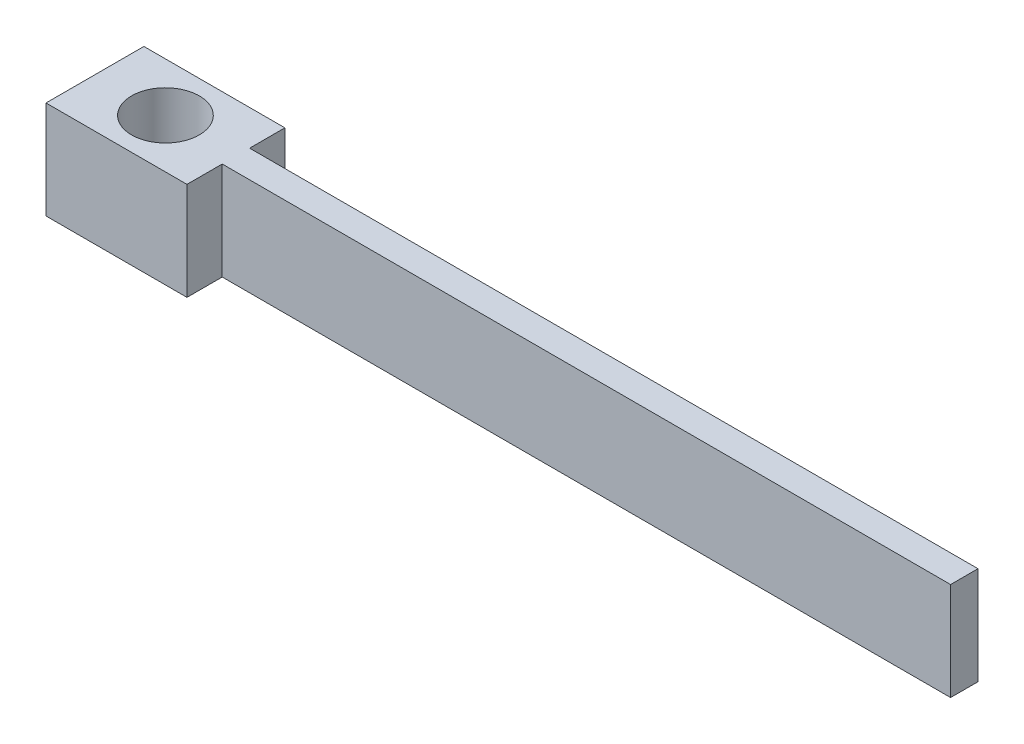
ISO-10303-21;
HEADER;
FILE_DESCRIPTION(('STEP AP214'),'2;1');
FILE_NAME('part.step','',(''),(''),'','','');
FILE_SCHEMA(('AUTOMOTIVE_DESIGN { 1 0 10303 214 1 1 1 1 }'));
ENDSEC;
DATA;
#1=APPLICATION_CONTEXT('core data for automotive mechanical design processes');
#2=APPLICATION_PROTOCOL_DEFINITION('international standard','automotive_design',2000,#1);
#3=PRODUCT_CONTEXT('',#1,'mechanical');
#4=PRODUCT('Part','Part','',(#3));
#5=PRODUCT_RELATED_PRODUCT_CATEGORY('part','',(#4));
#6=PRODUCT_DEFINITION_FORMATION('','',#4);
#7=PRODUCT_DEFINITION_CONTEXT('part definition',#1,'design');
#8=PRODUCT_DEFINITION('design','',#6,#7);
#9=PRODUCT_DEFINITION_SHAPE('','',#8);
#10=(LENGTH_UNIT() NAMED_UNIT(*) SI_UNIT(.MILLI.,.METRE.));
#11=(NAMED_UNIT(*) PLANE_ANGLE_UNIT() SI_UNIT($,.RADIAN.));
#12=(NAMED_UNIT(*) SI_UNIT($,.STERADIAN.) SOLID_ANGLE_UNIT());
#13=UNCERTAINTY_MEASURE_WITH_UNIT(LENGTH_MEASURE(1.E-05),#10,'distance_accuracy_value','');
#14=(GEOMETRIC_REPRESENTATION_CONTEXT(3) GLOBAL_UNCERTAINTY_ASSIGNED_CONTEXT((#13)) GLOBAL_UNIT_ASSIGNED_CONTEXT((#10,
#11,#12)) REPRESENTATION_CONTEXT('',''));
#15=CARTESIAN_POINT('',(0.,0.,0.));
#16=DIRECTION('',(0.,0.,1.));
#17=DIRECTION('',(1.,0.,0.));
#18=AXIS2_PLACEMENT_3D('',#15,#16,#17);
#19=CARTESIAN_POINT('',(28.194,3.175,-3.175));
#20=DIRECTION('',(-1.,0.,0.));
#21=DIRECTION('',(0.,0.,1.));
#22=AXIS2_PLACEMENT_3D('',#19,#20,#21);
#23=PLANE('',#22);
#24=DIRECTION('',(0.,1.,0.));
#25=VECTOR('',#24,1.);
#26=CARTESIAN_POINT('',(28.194,-3.175,0.889000000000001));
#27=LINE('',#26,#25);
#28=CARTESIAN_POINT('',(28.194,-3.175,0.889000000000001));
#29=VERTEX_POINT('',#28);
#30=CARTESIAN_POINT('',(28.194,3.175,0.889000000000001));
#31=VERTEX_POINT('',#30);
#32=EDGE_CURVE('E101',#29,#31,#27,.T.);
#33=ORIENTED_EDGE('',*,*,#32,.F.);
#34=DIRECTION('',(0.,0.,-1.));
#35=VECTOR('',#34,1.);
#36=CARTESIAN_POINT('',(28.194,-3.175,-3.175));
#37=LINE('',#36,#35);
#38=CARTESIAN_POINT('',(28.194,-3.175,-0.889000000000001));
#39=VERTEX_POINT('',#38);
#40=EDGE_CURVE('E112',#29,#39,#37,.T.);
#41=ORIENTED_EDGE('',*,*,#40,.T.);
#42=DIRECTION('',(0.,1.,0.));
#43=VECTOR('',#42,1.);
#44=CARTESIAN_POINT('',(28.194,-3.175,-0.889000000000001));
#45=LINE('',#44,#43);
#46=CARTESIAN_POINT('',(28.194,3.175,-0.889000000000001));
#47=VERTEX_POINT('',#46);
#48=EDGE_CURVE('E148',#39,#47,#45,.T.);
#49=ORIENTED_EDGE('',*,*,#48,.T.);
#50=DIRECTION('',(0.,0.,-1.));
#51=VECTOR('',#50,1.);
#52=CARTESIAN_POINT('',(28.194,3.175,-3.175));
#53=LINE('',#52,#51);
#54=EDGE_CURVE('E113',#31,#47,#53,.T.);
#55=ORIENTED_EDGE('',*,*,#54,.F.);
#56=EDGE_LOOP('',(#33,#41,#49,#55));
#57=FACE_BOUND('',#56,.T.);
#58=ADVANCED_FACE('F35',(#57),#23,.F.);
#59=CARTESIAN_POINT('',(-28.194,3.175,3.175));
#60=DIRECTION('',(0.,0.,-1.));
#61=DIRECTION('',(-1.,0.,0.));
#62=AXIS2_PLACEMENT_3D('',#59,#60,#61);
#63=PLANE('',#62);
#64=DIRECTION('',(0.,1.,0.));
#65=VECTOR('',#64,1.);
#66=CARTESIAN_POINT('',(-19.05,-3.175,3.17499999999999));
#67=LINE('',#66,#65);
#68=CARTESIAN_POINT('',(-19.05,-3.175,3.17499999999999));
#69=VERTEX_POINT('',#68);
#70=CARTESIAN_POINT('',(-19.05,3.175,3.17499999999999));
#71=VERTEX_POINT('',#70);
#72=EDGE_CURVE('E161',#69,#71,#67,.T.);
#73=ORIENTED_EDGE('',*,*,#72,.T.);
#74=DIRECTION('',(1.,0.,0.));
#75=VECTOR('',#74,1.);
#76=CARTESIAN_POINT('',(-28.194,3.175,3.175));
#77=LINE('',#76,#75);
#78=CARTESIAN_POINT('',(-28.194,3.175,3.175));
#79=VERTEX_POINT('',#78);
#80=EDGE_CURVE('E126',#79,#71,#77,.T.);
#81=ORIENTED_EDGE('',*,*,#80,.F.);
#82=DIRECTION('',(0.,-1.,0.));
#83=VECTOR('',#82,1.);
#84=CARTESIAN_POINT('',(-28.194,3.175,3.175));
#85=LINE('',#84,#83);
#86=CARTESIAN_POINT('',(-28.194,-3.175,3.175));
#87=VERTEX_POINT('',#86);
#88=EDGE_CURVE('E42',#79,#87,#85,.T.);
#89=ORIENTED_EDGE('',*,*,#88,.T.);
#90=DIRECTION('',(1.,0.,0.));
#91=VECTOR('',#90,1.);
#92=CARTESIAN_POINT('',(-28.194,-3.175,3.175));
#93=LINE('',#92,#91);
#94=EDGE_CURVE('E130',#87,#69,#93,.T.);
#95=ORIENTED_EDGE('',*,*,#94,.T.);
#96=EDGE_LOOP('',(#73,#81,#89,#95));
#97=FACE_BOUND('',#96,.T.);
#98=ADVANCED_FACE('F173',(#97),#63,.F.);
#99=CARTESIAN_POINT('',(0.,3.175,0.));
#100=DIRECTION('',(0.,1.,0.));
#101=DIRECTION('',(0.,0.,1.));
#102=AXIS2_PLACEMENT_3D('',#99,#100,#101);
#103=PLANE('',#102);
#104=CARTESIAN_POINT('',(-23.622,3.175,0.));
#105=DIRECTION('',(0.,1.,0.));
#106=DIRECTION('',(0.,0.,1.));
#107=AXIS2_PLACEMENT_3D('',#104,#105,#106);
#108=CIRCLE('',#107,2.1971);
#109=CARTESIAN_POINT('',(-23.622,3.175,2.1971));
#110=VERTEX_POINT('',#109);
#111=EDGE_CURVE('E123',#110,#110,#108,.T.);
#112=ORIENTED_EDGE('',*,*,#111,.F.);
#113=EDGE_LOOP('',(#112));
#114=FACE_BOUND('',#113,.T.);
#115=ORIENTED_EDGE('',*,*,#80,.T.);
#116=DIRECTION('',(0.,0.,-1.));
#117=VECTOR('',#116,1.);
#118=CARTESIAN_POINT('',(-19.05,3.175,3.17499999999999));
#119=LINE('',#118,#117);
#120=CARTESIAN_POINT('',(-19.05,3.175,0.888999999999995));
#121=VERTEX_POINT('',#120);
#122=EDGE_CURVE('E107',#71,#121,#119,.T.);
#123=ORIENTED_EDGE('',*,*,#122,.T.);
#124=DIRECTION('',(1.,0.,0.));
#125=VECTOR('',#124,1.);
#126=CARTESIAN_POINT('',(28.194,3.175,0.889000000000001));
#127=LINE('',#126,#125);
#128=EDGE_CURVE('E168',#121,#31,#127,.T.);
#129=ORIENTED_EDGE('',*,*,#128,.T.);
#130=ORIENTED_EDGE('',*,*,#54,.T.);
#131=DIRECTION('',(1.,0.,0.));
#132=VECTOR('',#131,1.);
#133=CARTESIAN_POINT('',(28.194,3.175,-0.889000000000001));
#134=LINE('',#133,#132);
#135=CARTESIAN_POINT('',(-19.05,3.175,-0.888999999999995));
#136=VERTEX_POINT('',#135);
#137=EDGE_CURVE('E154',#136,#47,#134,.T.);
#138=ORIENTED_EDGE('',*,*,#137,.F.);
#139=DIRECTION('',(0.,0.,1.));
#140=VECTOR('',#139,1.);
#141=CARTESIAN_POINT('',(-19.05,3.175,-3.17499999999999));
#142=LINE('',#141,#140);
#143=CARTESIAN_POINT('',(-19.05,3.175,-3.17499999999999));
#144=VERTEX_POINT('',#143);
#145=EDGE_CURVE('E158',#144,#136,#142,.T.);
#146=ORIENTED_EDGE('',*,*,#145,.F.);
#147=DIRECTION('',(-1.,0.,0.));
#148=VECTOR('',#147,1.);
#149=CARTESIAN_POINT('',(-28.194,3.175,-3.175));
#150=LINE('',#149,#148);
#151=CARTESIAN_POINT('',(-28.194,3.175,-3.175));
#152=VERTEX_POINT('',#151);
#153=EDGE_CURVE('E141',#144,#152,#150,.T.);
#154=ORIENTED_EDGE('',*,*,#153,.T.);
#155=DIRECTION('',(0.,0.,1.));
#156=VECTOR('',#155,1.);
#157=CARTESIAN_POINT('',(-28.194,3.175,-3.175));
#158=LINE('',#157,#156);
#159=EDGE_CURVE('E138',#152,#79,#158,.T.);
#160=ORIENTED_EDGE('',*,*,#159,.T.);
#161=EDGE_LOOP('',(#115,#123,#129,#130,#138,#146,#154,#160));
#162=FACE_BOUND('',#161,.T.);
#163=ADVANCED_FACE('F175',(#114,#162),#103,.T.);
#164=CARTESIAN_POINT('',(0.,-3.175,0.));
#165=DIRECTION('',(0.,1.,0.));
#166=DIRECTION('',(0.,0.,1.));
#167=AXIS2_PLACEMENT_3D('',#164,#165,#166);
#168=PLANE('',#167);
#169=CARTESIAN_POINT('',(-23.622,-3.175,0.));
#170=DIRECTION('',(0.,1.,0.));
#171=DIRECTION('',(0.,0.,1.));
#172=AXIS2_PLACEMENT_3D('',#169,#170,#171);
#173=CIRCLE('',#172,2.1971);
#174=CARTESIAN_POINT('',(-23.622,-3.175,2.1971));
#175=VERTEX_POINT('',#174);
#176=EDGE_CURVE('E118',#175,#175,#173,.T.);
#177=ORIENTED_EDGE('',*,*,#176,.T.);
#178=EDGE_LOOP('',(#177));
#179=FACE_BOUND('',#178,.T.);
#180=DIRECTION('',(0.,0.,-1.));
#181=VECTOR('',#180,1.);
#182=CARTESIAN_POINT('',(-19.05,-3.175,3.17499999999999));
#183=LINE('',#182,#181);
#184=CARTESIAN_POINT('',(-19.05,-3.175,0.888999999999995));
#185=VERTEX_POINT('',#184);
#186=EDGE_CURVE('E106',#69,#185,#183,.T.);
#187=ORIENTED_EDGE('',*,*,#186,.F.);
#188=ORIENTED_EDGE('',*,*,#94,.F.);
#189=DIRECTION('',(0.,0.,1.));
#190=VECTOR('',#189,1.);
#191=CARTESIAN_POINT('',(-28.194,-3.175,-3.175));
#192=LINE('',#191,#190);
#193=CARTESIAN_POINT('',(-28.194,-3.175,-3.175));
#194=VERTEX_POINT('',#193);
#195=EDGE_CURVE('E120',#194,#87,#192,.T.);
#196=ORIENTED_EDGE('',*,*,#195,.F.);
#197=DIRECTION('',(-1.,0.,0.));
#198=VECTOR('',#197,1.);
#199=CARTESIAN_POINT('',(-28.194,-3.175,-3.175));
#200=LINE('',#199,#198);
#201=CARTESIAN_POINT('',(-19.05,-3.175,-3.17499999999999));
#202=VERTEX_POINT('',#201);
#203=EDGE_CURVE('E117',#202,#194,#200,.T.);
#204=ORIENTED_EDGE('',*,*,#203,.F.);
#205=DIRECTION('',(0.,0.,1.));
#206=VECTOR('',#205,1.);
#207=CARTESIAN_POINT('',(-19.05,-3.175,-3.17499999999999));
#208=LINE('',#207,#206);
#209=CARTESIAN_POINT('',(-19.05,-3.175,-0.888999999999995));
#210=VERTEX_POINT('',#209);
#211=EDGE_CURVE('E157',#202,#210,#208,.T.);
#212=ORIENTED_EDGE('',*,*,#211,.T.);
#213=DIRECTION('',(1.,0.,0.));
#214=VECTOR('',#213,1.);
#215=CARTESIAN_POINT('',(28.194,-3.175,-0.889000000000001));
#216=LINE('',#215,#214);
#217=EDGE_CURVE('E57',#210,#39,#216,.T.);
#218=ORIENTED_EDGE('',*,*,#217,.T.);
#219=ORIENTED_EDGE('',*,*,#40,.F.);
#220=DIRECTION('',(1.,0.,0.));
#221=VECTOR('',#220,1.);
#222=CARTESIAN_POINT('',(28.194,-3.175,0.889000000000001));
#223=LINE('',#222,#221);
#224=EDGE_CURVE('E98',#185,#29,#223,.T.);
#225=ORIENTED_EDGE('',*,*,#224,.F.);
#226=EDGE_LOOP('',(#187,#188,#196,#204,#212,#218,#219,#225));
#227=FACE_BOUND('',#226,.T.);
#228=ADVANCED_FACE('F115',(#179,#227),#168,.F.);
#229=CARTESIAN_POINT('',(-28.194,3.175,-3.175));
#230=DIRECTION('',(0.,0.,1.));
#231=DIRECTION('',(1.,0.,0.));
#232=AXIS2_PLACEMENT_3D('',#229,#230,#231);
#233=PLANE('',#232);
#234=ORIENTED_EDGE('',*,*,#153,.F.);
#235=DIRECTION('',(0.,1.,0.));
#236=VECTOR('',#235,1.);
#237=CARTESIAN_POINT('',(-19.05,-3.175,-3.17499999999999));
#238=LINE('',#237,#236);
#239=EDGE_CURVE('E149',#202,#144,#238,.T.);
#240=ORIENTED_EDGE('',*,*,#239,.F.);
#241=ORIENTED_EDGE('',*,*,#203,.T.);
#242=DIRECTION('',(0.,-1.,0.));
#243=VECTOR('',#242,1.);
#244=CARTESIAN_POINT('',(-28.194,3.175,-3.175));
#245=LINE('',#244,#243);
#246=EDGE_CURVE('E11',#152,#194,#245,.T.);
#247=ORIENTED_EDGE('',*,*,#246,.F.);
#248=EDGE_LOOP('',(#234,#240,#241,#247));
#249=FACE_BOUND('',#248,.T.);
#250=ADVANCED_FACE('F188',(#249),#233,.F.);
#251=CARTESIAN_POINT('',(-28.194,3.175,-3.175));
#252=DIRECTION('',(1.,0.,0.));
#253=DIRECTION('',(0.,0.,-1.));
#254=AXIS2_PLACEMENT_3D('',#251,#252,#253);
#255=PLANE('',#254);
#256=ORIENTED_EDGE('',*,*,#195,.T.);
#257=ORIENTED_EDGE('',*,*,#88,.F.);
#258=ORIENTED_EDGE('',*,*,#159,.F.);
#259=ORIENTED_EDGE('',*,*,#246,.T.);
#260=EDGE_LOOP('',(#256,#257,#258,#259));
#261=FACE_BOUND('',#260,.T.);
#262=ADVANCED_FACE('F185',(#261),#255,.F.);
#263=CARTESIAN_POINT('',(-23.622,3.175,0.));
#264=DIRECTION('',(0.,1.,0.));
#265=DIRECTION('',(0.,0.,1.));
#266=AXIS2_PLACEMENT_3D('',#263,#264,#265);
#267=CYLINDRICAL_SURFACE('',#266,2.1971);
#268=ORIENTED_EDGE('',*,*,#176,.F.);
#269=EDGE_LOOP('',(#268));
#270=FACE_BOUND('',#269,.T.);
#271=ORIENTED_EDGE('',*,*,#111,.T.);
#272=EDGE_LOOP('',(#271));
#273=FACE_BOUND('',#272,.T.);
#274=ADVANCED_FACE('F187',(#270,#273),#267,.F.);
#275=CARTESIAN_POINT('',(28.194,-3.175,-0.889000000000001));
#276=DIRECTION('',(0.,0.,1.));
#277=DIRECTION('',(1.,0.,0.));
#278=AXIS2_PLACEMENT_3D('',#275,#276,#277);
#279=PLANE('',#278);
#280=ORIENTED_EDGE('',*,*,#137,.T.);
#281=ORIENTED_EDGE('',*,*,#48,.F.);
#282=ORIENTED_EDGE('',*,*,#217,.F.);
#283=DIRECTION('',(0.,1.,0.));
#284=VECTOR('',#283,1.);
#285=CARTESIAN_POINT('',(-19.05,-3.175,-0.888999999999995));
#286=LINE('',#285,#284);
#287=EDGE_CURVE('E151',#210,#136,#286,.T.);
#288=ORIENTED_EDGE('',*,*,#287,.T.);
#289=EDGE_LOOP('',(#280,#281,#282,#288));
#290=FACE_BOUND('',#289,.T.);
#291=ADVANCED_FACE('F204',(#290),#279,.F.);
#292=CARTESIAN_POINT('',(-19.05,-3.175,-3.17499999999999));
#293=DIRECTION('',(-1.,0.,0.));
#294=DIRECTION('',(0.,0.,1.));
#295=AXIS2_PLACEMENT_3D('',#292,#293,#294);
#296=PLANE('',#295);
#297=ORIENTED_EDGE('',*,*,#145,.T.);
#298=ORIENTED_EDGE('',*,*,#287,.F.);
#299=ORIENTED_EDGE('',*,*,#211,.F.);
#300=ORIENTED_EDGE('',*,*,#239,.T.);
#301=EDGE_LOOP('',(#297,#298,#299,#300));
#302=FACE_BOUND('',#301,.T.);
#303=ADVANCED_FACE('F203',(#302),#296,.F.);
#304=CARTESIAN_POINT('',(-19.05,-3.175,3.17499999999999));
#305=DIRECTION('',(1.,0.,0.));
#306=DIRECTION('',(0.,0.,-1.));
#307=AXIS2_PLACEMENT_3D('',#304,#305,#306);
#308=PLANE('',#307);
#309=ORIENTED_EDGE('',*,*,#122,.F.);
#310=ORIENTED_EDGE('',*,*,#72,.F.);
#311=ORIENTED_EDGE('',*,*,#186,.T.);
#312=DIRECTION('',(0.,1.,0.));
#313=VECTOR('',#312,1.);
#314=CARTESIAN_POINT('',(-19.05,-3.175,0.888999999999995));
#315=LINE('',#314,#313);
#316=EDGE_CURVE('E49',#185,#121,#315,.T.);
#317=ORIENTED_EDGE('',*,*,#316,.T.);
#318=EDGE_LOOP('',(#309,#310,#311,#317));
#319=FACE_BOUND('',#318,.T.);
#320=ADVANCED_FACE('F171',(#319),#308,.T.);
#321=CARTESIAN_POINT('',(28.194,-3.175,0.889000000000001));
#322=DIRECTION('',(0.,0.,1.));
#323=DIRECTION('',(1.,0.,0.));
#324=AXIS2_PLACEMENT_3D('',#321,#322,#323);
#325=PLANE('',#324);
#326=ORIENTED_EDGE('',*,*,#128,.F.);
#327=ORIENTED_EDGE('',*,*,#316,.F.);
#328=ORIENTED_EDGE('',*,*,#224,.T.);
#329=ORIENTED_EDGE('',*,*,#32,.T.);
#330=EDGE_LOOP('',(#326,#327,#328,#329));
#331=FACE_BOUND('',#330,.T.);
#332=ADVANCED_FACE('F100',(#331),#325,.T.);
#333=CLOSED_SHELL('',(#58,#98,#163,#228,#250,#262,#274,#291,#303,#320,#332));
#334=MANIFOLD_SOLID_BREP('B2',#333);
#335=ADVANCED_BREP_SHAPE_REPRESENTATION('',(#18,#334),#14);
#336=SHAPE_DEFINITION_REPRESENTATION(#9,#335);
ENDSEC;
END-ISO-10303-21;
